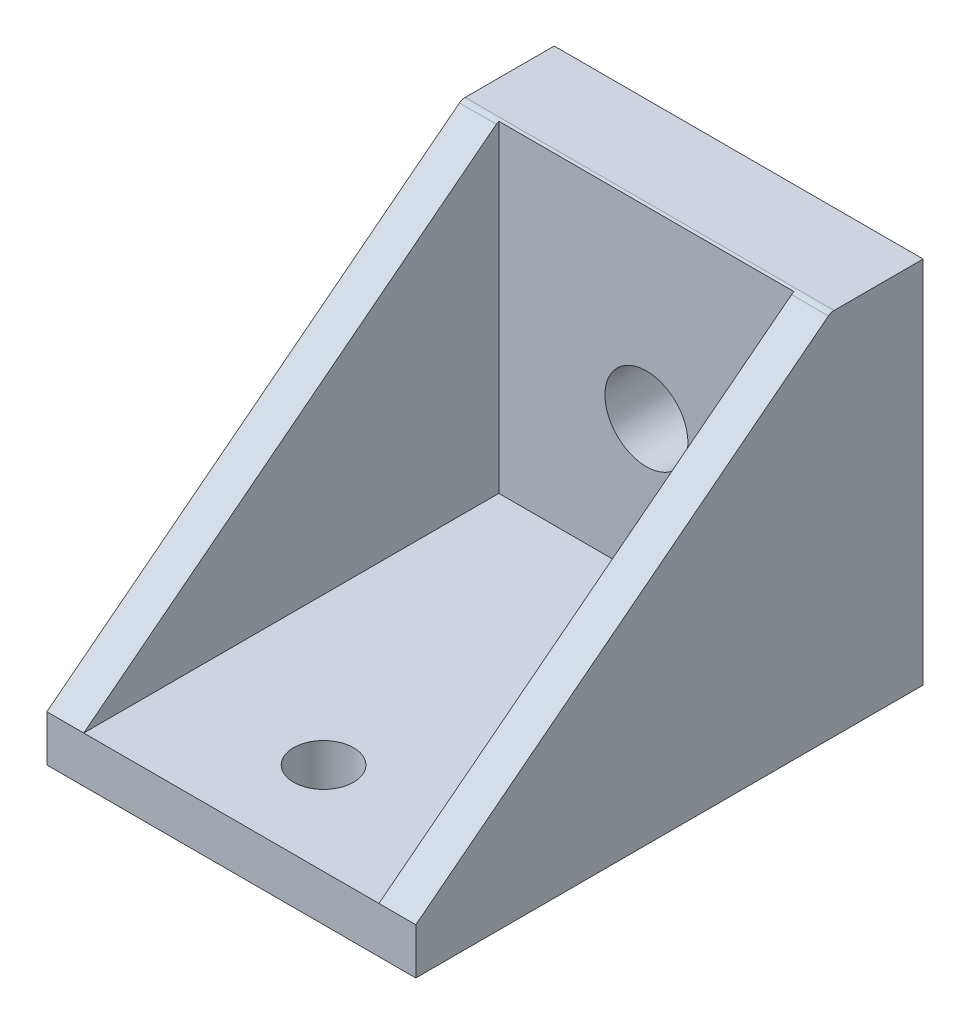
ISO-10303-21;
HEADER;
FILE_DESCRIPTION(('STEP AP214'),'2;1');
FILE_NAME('part.step','',(''),(''),'','','');
FILE_SCHEMA(('AUTOMOTIVE_DESIGN { 1 0 10303 214 1 1 1 1 }'));
ENDSEC;
DATA;
#1=APPLICATION_CONTEXT('core data for automotive mechanical design processes');
#2=APPLICATION_PROTOCOL_DEFINITION('international standard','automotive_design',2000,#1);
#3=PRODUCT_CONTEXT('',#1,'mechanical');
#4=PRODUCT('Part','Part','',(#3));
#5=PRODUCT_RELATED_PRODUCT_CATEGORY('part','',(#4));
#6=PRODUCT_DEFINITION_FORMATION('','',#4);
#7=PRODUCT_DEFINITION_CONTEXT('part definition',#1,'design');
#8=PRODUCT_DEFINITION('design','',#6,#7);
#9=PRODUCT_DEFINITION_SHAPE('','',#8);
#10=(LENGTH_UNIT() NAMED_UNIT(*) SI_UNIT(.MILLI.,.METRE.));
#11=(NAMED_UNIT(*) PLANE_ANGLE_UNIT() SI_UNIT($,.RADIAN.));
#12=(NAMED_UNIT(*) SI_UNIT($,.STERADIAN.) SOLID_ANGLE_UNIT());
#13=UNCERTAINTY_MEASURE_WITH_UNIT(LENGTH_MEASURE(1.E-05),#10,'distance_accuracy_value','');
#14=(GEOMETRIC_REPRESENTATION_CONTEXT(3) GLOBAL_UNCERTAINTY_ASSIGNED_CONTEXT((#13)) GLOBAL_UNIT_ASSIGNED_CONTEXT((#10,
#11,#12)) REPRESENTATION_CONTEXT('',''));
#15=CARTESIAN_POINT('',(0.,0.,0.));
#16=DIRECTION('',(0.,0.,1.));
#17=DIRECTION('',(1.,0.,0.));
#18=AXIS2_PLACEMENT_3D('',#15,#16,#17);
#19=CARTESIAN_POINT('',(0.,0.,10.));
#20=DIRECTION('',(0.,0.,-1.));
#21=DIRECTION('',(-1.,0.,0.));
#22=AXIS2_PLACEMENT_3D('',#19,#20,#21);
#23=PLANE('',#22);
#24=CARTESIAN_POINT('',(0.,0.,10.));
#25=DIRECTION('',(0.,0.,1.));
#26=DIRECTION('',(1.,0.,0.));
#27=AXIS2_PLACEMENT_3D('',#24,#25,#26);
#28=CIRCLE('',#27,4.5);
#29=CARTESIAN_POINT('',(4.50000000000001,0.,10.));
#30=VERTEX_POINT('',#29);
#31=EDGE_CURVE('E169',#30,#30,#28,.T.);
#32=ORIENTED_EDGE('',*,*,#31,.F.);
#33=EDGE_LOOP('',(#32));
#34=FACE_BOUND('',#33,.T.);
#35=DIRECTION('',(1.,0.,0.));
#36=VECTOR('',#35,1.);
#37=CARTESIAN_POINT('',(16.,19.9392960511962,10.));
#38=LINE('',#37,#36);
#39=CARTESIAN_POINT('',(16.,19.9392960511962,10.));
#40=VERTEX_POINT('',#39);
#41=CARTESIAN_POINT('',(-16.,19.9392960511962,10.));
#42=VERTEX_POINT('',#41);
#43=EDGE_CURVE('E201',#40,#42,#38,.F.);
#44=ORIENTED_EDGE('',*,*,#43,.T.);
#45=DIRECTION('',(0.,1.,0.));
#46=VECTOR('',#45,1.);
#47=CARTESIAN_POINT('',(-16.,20.,10.));
#48=LINE('',#47,#46);
#49=CARTESIAN_POINT('',(-16.,-15.,10.));
#50=VERTEX_POINT('',#49);
#51=EDGE_CURVE('E126',#50,#42,#48,.T.);
#52=ORIENTED_EDGE('',*,*,#51,.F.);
#53=DIRECTION('',(1.,0.,0.));
#54=VECTOR('',#53,1.);
#55=CARTESIAN_POINT('',(0.,-15.,10.));
#56=LINE('',#55,#54);
#57=CARTESIAN_POINT('',(16.,-15.,10.));
#58=VERTEX_POINT('',#57);
#59=EDGE_CURVE('E146',#50,#58,#56,.T.);
#60=ORIENTED_EDGE('',*,*,#59,.T.);
#61=DIRECTION('',(0.,1.,0.));
#62=VECTOR('',#61,1.);
#63=CARTESIAN_POINT('',(16.,20.,10.));
#64=LINE('',#63,#62);
#65=EDGE_CURVE('E210',#58,#40,#64,.T.);
#66=ORIENTED_EDGE('',*,*,#65,.T.);
#67=EDGE_LOOP('',(#44,#52,#60,#66));
#68=FACE_BOUND('',#67,.T.);
#69=ADVANCED_FACE('F39',(#34,#68),#23,.F.);
#70=CARTESIAN_POINT('',(0.,-15.,0.));
#71=DIRECTION('',(0.,1.,0.));
#72=DIRECTION('',(0.,0.,1.));
#73=AXIS2_PLACEMENT_3D('',#70,#71,#72);
#74=PLANE('',#73);
#75=CARTESIAN_POINT('',(0.,-15.,45.));
#76=DIRECTION('',(0.,-1.,0.));
#77=DIRECTION('',(0.,0.,-1.));
#78=AXIS2_PLACEMENT_3D('',#75,#76,#77);
#79=CIRCLE('',#78,3.25);
#80=CARTESIAN_POINT('',(0.,-15.,41.75));
#81=VERTEX_POINT('',#80);
#82=EDGE_CURVE('E157',#81,#81,#79,.T.);
#83=ORIENTED_EDGE('',*,*,#82,.T.);
#84=EDGE_LOOP('',(#83));
#85=FACE_BOUND('',#84,.T.);
#86=ORIENTED_EDGE('',*,*,#59,.F.);
#87=DIRECTION('',(0.,0.,-1.));
#88=VECTOR('',#87,1.);
#89=CARTESIAN_POINT('',(-16.,-15.,10.));
#90=LINE('',#89,#88);
#91=CARTESIAN_POINT('',(-16.,-15.,55.));
#92=VERTEX_POINT('',#91);
#93=EDGE_CURVE('E119',#92,#50,#90,.T.);
#94=ORIENTED_EDGE('',*,*,#93,.F.);
#95=DIRECTION('',(-1.,0.,0.));
#96=VECTOR('',#95,1.);
#97=CARTESIAN_POINT('',(-20.,-15.,55.));
#98=LINE('',#97,#96);
#99=CARTESIAN_POINT('',(16.,-15.,55.));
#100=VERTEX_POINT('',#99);
#101=EDGE_CURVE('E144',#100,#92,#98,.T.);
#102=ORIENTED_EDGE('',*,*,#101,.F.);
#103=DIRECTION('',(0.,0.,-1.));
#104=VECTOR('',#103,1.);
#105=CARTESIAN_POINT('',(16.,-15.,10.));
#106=LINE('',#105,#104);
#107=EDGE_CURVE('E215',#100,#58,#106,.T.);
#108=ORIENTED_EDGE('',*,*,#107,.T.);
#109=EDGE_LOOP('',(#86,#94,#102,#108));
#110=FACE_BOUND('',#109,.T.);
#111=ADVANCED_FACE('F142',(#85,#110),#74,.T.);
#112=CARTESIAN_POINT('',(0.,0.,0.));
#113=DIRECTION('',(0.,0.,-1.));
#114=DIRECTION('',(-1.,0.,0.));
#115=AXIS2_PLACEMENT_3D('',#112,#113,#114);
#116=PLANE('',#115);
#117=DIRECTION('',(-1.,0.,0.));
#118=VECTOR('',#117,1.);
#119=CARTESIAN_POINT('',(-20.,20.,0.));
#120=LINE('',#119,#118);
#121=CARTESIAN_POINT('',(20.,20.,0.));
#122=VERTEX_POINT('',#121);
#123=CARTESIAN_POINT('',(-20.,20.,0.));
#124=VERTEX_POINT('',#123);
#125=EDGE_CURVE('E177',#122,#124,#120,.T.);
#126=ORIENTED_EDGE('',*,*,#125,.F.);
#127=DIRECTION('',(0.,1.,0.));
#128=VECTOR('',#127,1.);
#129=CARTESIAN_POINT('',(20.,-20.,0.));
#130=LINE('',#129,#128);
#131=CARTESIAN_POINT('',(20.,-20.,0.));
#132=VERTEX_POINT('',#131);
#133=EDGE_CURVE('E172',#132,#122,#130,.T.);
#134=ORIENTED_EDGE('',*,*,#133,.F.);
#135=DIRECTION('',(1.,0.,0.));
#136=VECTOR('',#135,1.);
#137=CARTESIAN_POINT('',(-20.,-20.,0.));
#138=LINE('',#137,#136);
#139=CARTESIAN_POINT('',(-20.,-20.,0.));
#140=VERTEX_POINT('',#139);
#141=EDGE_CURVE('E182',#140,#132,#138,.T.);
#142=ORIENTED_EDGE('',*,*,#141,.F.);
#143=DIRECTION('',(0.,-1.,0.));
#144=VECTOR('',#143,1.);
#145=CARTESIAN_POINT('',(-20.,-20.,0.));
#146=LINE('',#145,#144);
#147=EDGE_CURVE('E180',#124,#140,#146,.T.);
#148=ORIENTED_EDGE('',*,*,#147,.F.);
#149=EDGE_LOOP('',(#126,#134,#142,#148));
#150=FACE_BOUND('',#149,.T.);
#151=CARTESIAN_POINT('',(0.,0.,0.));
#152=DIRECTION('',(0.,0.,1.));
#153=DIRECTION('',(1.,0.,0.));
#154=AXIS2_PLACEMENT_3D('',#151,#152,#153);
#155=CIRCLE('',#154,4.5);
#156=CARTESIAN_POINT('',(4.50000000000001,0.,0.));
#157=VERTEX_POINT('',#156);
#158=EDGE_CURVE('E168',#157,#157,#155,.T.);
#159=ORIENTED_EDGE('',*,*,#158,.T.);
#160=EDGE_LOOP('',(#159));
#161=FACE_BOUND('',#160,.T.);
#162=ADVANCED_FACE('F257',(#150,#161),#116,.T.);
#163=CARTESIAN_POINT('',(20.,-20.,10.));
#164=DIRECTION('',(-1.,0.,0.));
#165=DIRECTION('',(0.,0.,1.));
#166=AXIS2_PLACEMENT_3D('',#163,#164,#165);
#167=PLANE('',#166);
#168=DIRECTION('',(0.,0.,-1.));
#169=VECTOR('',#168,1.);
#170=CARTESIAN_POINT('',(20.,20.,10.));
#171=LINE('',#170,#169);
#172=CARTESIAN_POINT('',(20.,20.,9.65689224985838));
#173=VERTEX_POINT('',#172);
#174=EDGE_CURVE('E192',#173,#122,#171,.T.);
#175=ORIENTED_EDGE('',*,*,#174,.F.);
#176=CARTESIAN_POINT('',(20.,19.,9.65689224985838));
#177=DIRECTION('',(-1.,0.,0.));
#178=DIRECTION('',(0.,0.,1.));
#179=AXIS2_PLACEMENT_3D('',#176,#177,#178);
#180=CIRCLE('',#179,1.);
#181=CARTESIAN_POINT('',(20.,19.7893522173763,10.2708328633733));
#182=VERTEX_POINT('',#181);
#183=EDGE_CURVE('E11',#173,#182,#180,.F.);
#184=ORIENTED_EDGE('',*,*,#183,.T.);
#185=DIRECTION('',(0.,-0.61394061351492,0.789352217376326));
#186=VECTOR('',#185,1.);
#187=CARTESIAN_POINT('',(20.,-15.,55.));
#188=LINE('',#187,#186);
#189=CARTESIAN_POINT('',(20.,-15.,55.));
#190=VERTEX_POINT('',#189);
#191=EDGE_CURVE('E137',#182,#190,#188,.T.);
#192=ORIENTED_EDGE('',*,*,#191,.T.);
#193=DIRECTION('',(0.,-1.,0.));
#194=VECTOR('',#193,1.);
#195=CARTESIAN_POINT('',(20.,-15.,55.));
#196=LINE('',#195,#194);
#197=CARTESIAN_POINT('',(20.,-20.,55.));
#198=VERTEX_POINT('',#197);
#199=EDGE_CURVE('E155',#190,#198,#196,.T.);
#200=ORIENTED_EDGE('',*,*,#199,.T.);
#201=DIRECTION('',(0.,0.,-1.));
#202=VECTOR('',#201,1.);
#203=CARTESIAN_POINT('',(20.,-20.,10.));
#204=LINE('',#203,#202);
#205=EDGE_CURVE('E184',#198,#132,#204,.T.);
#206=ORIENTED_EDGE('',*,*,#205,.T.);
#207=ORIENTED_EDGE('',*,*,#133,.T.);
#208=EDGE_LOOP('',(#175,#184,#192,#200,#206,#207));
#209=FACE_BOUND('',#208,.T.);
#210=ADVANCED_FACE('F261',(#209),#167,.F.);
#211=CARTESIAN_POINT('',(-20.,20.,10.));
#212=DIRECTION('',(0.,-1.,0.));
#213=DIRECTION('',(0.,0.,-1.));
#214=AXIS2_PLACEMENT_3D('',#211,#212,#213);
#215=PLANE('',#214);
#216=DIRECTION('',(0.,0.,-1.));
#217=VECTOR('',#216,1.);
#218=CARTESIAN_POINT('',(-20.,20.,10.));
#219=LINE('',#218,#217);
#220=CARTESIAN_POINT('',(-20.,20.,9.65689224985838));
#221=VERTEX_POINT('',#220);
#222=EDGE_CURVE('E190',#221,#124,#219,.T.);
#223=ORIENTED_EDGE('',*,*,#222,.F.);
#224=DIRECTION('',(-1.,0.,0.));
#225=VECTOR('',#224,1.);
#226=CARTESIAN_POINT('',(20.,20.,9.65689224985838));
#227=LINE('',#226,#225);
#228=EDGE_CURVE('E199',#221,#173,#227,.F.);
#229=ORIENTED_EDGE('',*,*,#228,.T.);
#230=ORIENTED_EDGE('',*,*,#174,.T.);
#231=ORIENTED_EDGE('',*,*,#125,.T.);
#232=EDGE_LOOP('',(#223,#229,#230,#231));
#233=FACE_BOUND('',#232,.T.);
#234=ADVANCED_FACE('F246',(#233),#215,.F.);
#235=CARTESIAN_POINT('',(-20.,-20.,10.));
#236=DIRECTION('',(1.,0.,0.));
#237=DIRECTION('',(0.,0.,-1.));
#238=AXIS2_PLACEMENT_3D('',#235,#236,#237);
#239=PLANE('',#238);
#240=DIRECTION('',(0.,-0.61394061351492,0.789352217376326));
#241=VECTOR('',#240,1.);
#242=CARTESIAN_POINT('',(-20.,-15.,55.));
#243=LINE('',#242,#241);
#244=CARTESIAN_POINT('',(-20.,19.7893522173763,10.2708328633733));
#245=VERTEX_POINT('',#244);
#246=CARTESIAN_POINT('',(-20.,-15.,55.));
#247=VERTEX_POINT('',#246);
#248=EDGE_CURVE('E132',#245,#247,#243,.T.);
#249=ORIENTED_EDGE('',*,*,#248,.F.);
#250=CARTESIAN_POINT('',(-20.,19.,9.65689224985838));
#251=DIRECTION('',(1.,0.,0.));
#252=DIRECTION('',(0.,0.,-1.));
#253=AXIS2_PLACEMENT_3D('',#250,#251,#252);
#254=CIRCLE('',#253,1.);
#255=EDGE_CURVE('E196',#245,#221,#254,.F.);
#256=ORIENTED_EDGE('',*,*,#255,.T.);
#257=ORIENTED_EDGE('',*,*,#222,.T.);
#258=ORIENTED_EDGE('',*,*,#147,.T.);
#259=DIRECTION('',(0.,0.,-1.));
#260=VECTOR('',#259,1.);
#261=CARTESIAN_POINT('',(-20.,-20.,10.));
#262=LINE('',#261,#260);
#263=CARTESIAN_POINT('',(-20.,-20.,55.));
#264=VERTEX_POINT('',#263);
#265=EDGE_CURVE('E187',#264,#140,#262,.T.);
#266=ORIENTED_EDGE('',*,*,#265,.F.);
#267=DIRECTION('',(0.,-1.,0.));
#268=VECTOR('',#267,1.);
#269=CARTESIAN_POINT('',(-20.,-15.,55.));
#270=LINE('',#269,#268);
#271=EDGE_CURVE('E163',#247,#264,#270,.T.);
#272=ORIENTED_EDGE('',*,*,#271,.F.);
#273=EDGE_LOOP('',(#249,#256,#257,#258,#266,#272));
#274=FACE_BOUND('',#273,.T.);
#275=ADVANCED_FACE('F218',(#274),#239,.F.);
#276=CARTESIAN_POINT('',(-20.,-20.,10.));
#277=DIRECTION('',(0.,1.,0.));
#278=DIRECTION('',(0.,0.,1.));
#279=AXIS2_PLACEMENT_3D('',#276,#277,#278);
#280=PLANE('',#279);
#281=ORIENTED_EDGE('',*,*,#141,.T.);
#282=ORIENTED_EDGE('',*,*,#205,.F.);
#283=DIRECTION('',(-1.,0.,0.));
#284=VECTOR('',#283,1.);
#285=CARTESIAN_POINT('',(-20.,-20.,55.));
#286=LINE('',#285,#284);
#287=EDGE_CURVE('E153',#198,#264,#286,.T.);
#288=ORIENTED_EDGE('',*,*,#287,.T.);
#289=ORIENTED_EDGE('',*,*,#265,.T.);
#290=EDGE_LOOP('',(#281,#282,#288,#289));
#291=FACE_BOUND('',#290,.T.);
#292=CARTESIAN_POINT('',(0.,-20.,45.));
#293=DIRECTION('',(0.,-1.,0.));
#294=DIRECTION('',(0.,0.,-1.));
#295=AXIS2_PLACEMENT_3D('',#292,#293,#294);
#296=CIRCLE('',#295,3.25);
#297=CARTESIAN_POINT('',(0.,-20.,41.75));
#298=VERTEX_POINT('',#297);
#299=EDGE_CURVE('E160',#298,#298,#296,.T.);
#300=ORIENTED_EDGE('',*,*,#299,.F.);
#301=EDGE_LOOP('',(#300));
#302=FACE_BOUND('',#301,.T.);
#303=ADVANCED_FACE('F233',(#291,#302),#280,.F.);
#304=CARTESIAN_POINT('',(0.,0.,10.));
#305=DIRECTION('',(0.,0.,-1.));
#306=DIRECTION('',(-1.,0.,0.));
#307=AXIS2_PLACEMENT_3D('',#304,#305,#306);
#308=CYLINDRICAL_SURFACE('',#307,4.5);
#309=ORIENTED_EDGE('',*,*,#31,.T.);
#310=EDGE_LOOP('',(#309));
#311=FACE_BOUND('',#310,.T.);
#312=ORIENTED_EDGE('',*,*,#158,.F.);
#313=EDGE_LOOP('',(#312));
#314=FACE_BOUND('',#313,.T.);
#315=ADVANCED_FACE('F235',(#311,#314),#308,.F.);
#316=CARTESIAN_POINT('',(-20.,-15.,55.));
#317=DIRECTION('',(0.,0.,1.));
#318=DIRECTION('',(1.,0.,0.));
#319=AXIS2_PLACEMENT_3D('',#316,#317,#318);
#320=PLANE('',#319);
#321=ORIENTED_EDGE('',*,*,#287,.F.);
#322=ORIENTED_EDGE('',*,*,#199,.F.);
#323=EDGE_CURVE('E152',#190,#100,#98,.T.);
#324=ORIENTED_EDGE('',*,*,#323,.T.);
#325=ORIENTED_EDGE('',*,*,#101,.T.);
#326=DIRECTION('',(-1.,0.,0.));
#327=VECTOR('',#326,1.);
#328=CARTESIAN_POINT('',(-16.,-15.,55.));
#329=LINE('',#328,#327);
#330=EDGE_CURVE('E129',#92,#247,#329,.T.);
#331=ORIENTED_EDGE('',*,*,#330,.T.);
#332=ORIENTED_EDGE('',*,*,#271,.T.);
#333=EDGE_LOOP('',(#321,#322,#324,#325,#331,#332));
#334=FACE_BOUND('',#333,.T.);
#335=ADVANCED_FACE('F149',(#334),#320,.T.);
#336=CARTESIAN_POINT('',(0.,-15.,45.));
#337=DIRECTION('',(0.,-1.,0.));
#338=DIRECTION('',(0.,0.,-1.));
#339=AXIS2_PLACEMENT_3D('',#336,#337,#338);
#340=CYLINDRICAL_SURFACE('',#339,3.25);
#341=ORIENTED_EDGE('',*,*,#82,.F.);
#342=EDGE_LOOP('',(#341));
#343=FACE_BOUND('',#342,.T.);
#344=ORIENTED_EDGE('',*,*,#299,.T.);
#345=EDGE_LOOP('',(#344));
#346=FACE_BOUND('',#345,.T.);
#347=ADVANCED_FACE('F231',(#343,#346),#340,.F.);
#348=CARTESIAN_POINT('',(16.,-15.,55.));
#349=DIRECTION('',(0.,0.789352217376326,0.61394061351492));
#350=DIRECTION('',(0.,-0.613940613514921,0.789352217376326));
#351=AXIS2_PLACEMENT_3D('',#348,#349,#350);
#352=PLANE('',#351);
#353=ORIENTED_EDGE('',*,*,#191,.F.);
#354=DIRECTION('',(-1.,0.,0.));
#355=VECTOR('',#354,1.);
#356=CARTESIAN_POINT('',(16.,19.7893522173763,10.2708328633733));
#357=LINE('',#356,#355);
#358=CARTESIAN_POINT('',(16.,19.7893522173763,10.2708328633733));
#359=VERTEX_POINT('',#358);
#360=EDGE_CURVE('E54',#182,#359,#357,.T.);
#361=ORIENTED_EDGE('',*,*,#360,.T.);
#362=DIRECTION('',(0.,-0.61394061351492,0.789352217376326));
#363=VECTOR('',#362,1.);
#364=CARTESIAN_POINT('',(16.,-15.,55.));
#365=LINE('',#364,#363);
#366=EDGE_CURVE('E211',#359,#100,#365,.T.);
#367=ORIENTED_EDGE('',*,*,#366,.T.);
#368=ORIENTED_EDGE('',*,*,#323,.F.);
#369=EDGE_LOOP('',(#353,#361,#367,#368));
#370=FACE_BOUND('',#369,.T.);
#371=ADVANCED_FACE('F273',(#370),#352,.T.);
#372=CARTESIAN_POINT('',(16.,0.,0.));
#373=DIRECTION('',(1.,0.,0.));
#374=DIRECTION('',(0.,0.,-1.));
#375=AXIS2_PLACEMENT_3D('',#372,#373,#374);
#376=PLANE('',#375);
#377=ORIENTED_EDGE('',*,*,#366,.F.);
#378=CARTESIAN_POINT('',(16.,19.,9.65689224985838));
#379=DIRECTION('',(1.,0.,0.));
#380=DIRECTION('',(0.,0.,-1.));
#381=AXIS2_PLACEMENT_3D('',#378,#379,#380);
#382=CIRCLE('',#381,1.);
#383=EDGE_CURVE('E47',#359,#40,#382,.F.);
#384=ORIENTED_EDGE('',*,*,#383,.T.);
#385=ORIENTED_EDGE('',*,*,#65,.F.);
#386=ORIENTED_EDGE('',*,*,#107,.F.);
#387=EDGE_LOOP('',(#377,#384,#385,#386));
#388=FACE_BOUND('',#387,.T.);
#389=ADVANCED_FACE('F208',(#388),#376,.F.);
#390=CARTESIAN_POINT('',(-16.,-15.,55.));
#391=DIRECTION('',(0.,-0.789352217376326,-0.61394061351492));
#392=DIRECTION('',(0.,0.613940613514921,-0.789352217376326));
#393=AXIS2_PLACEMENT_3D('',#390,#391,#392);
#394=PLANE('',#393);
#395=DIRECTION('',(0.,-0.61394061351492,0.789352217376326));
#396=VECTOR('',#395,1.);
#397=CARTESIAN_POINT('',(-16.,-15.,55.));
#398=LINE('',#397,#396);
#399=CARTESIAN_POINT('',(-16.,19.7893522173763,10.2708328633733));
#400=VERTEX_POINT('',#399);
#401=EDGE_CURVE('E114',#400,#92,#398,.T.);
#402=ORIENTED_EDGE('',*,*,#401,.F.);
#403=DIRECTION('',(-1.,0.,0.));
#404=VECTOR('',#403,1.);
#405=CARTESIAN_POINT('',(-16.,19.7893522173763,10.2708328633733));
#406=LINE('',#405,#404);
#407=EDGE_CURVE('E194',#400,#245,#406,.T.);
#408=ORIENTED_EDGE('',*,*,#407,.T.);
#409=ORIENTED_EDGE('',*,*,#248,.T.);
#410=ORIENTED_EDGE('',*,*,#330,.F.);
#411=EDGE_LOOP('',(#402,#408,#409,#410));
#412=FACE_BOUND('',#411,.T.);
#413=ADVANCED_FACE('F130',(#412),#394,.F.);
#414=CARTESIAN_POINT('',(-16.,0.,0.));
#415=DIRECTION('',(-1.,0.,0.));
#416=DIRECTION('',(0.,0.,-1.));
#417=AXIS2_PLACEMENT_3D('',#414,#415,#416);
#418=PLANE('',#417);
#419=ORIENTED_EDGE('',*,*,#51,.T.);
#420=CARTESIAN_POINT('',(-16.,19.,9.65689224985838));
#421=DIRECTION('',(-1.,0.,0.));
#422=DIRECTION('',(0.,0.,1.));
#423=AXIS2_PLACEMENT_3D('',#420,#421,#422);
#424=CIRCLE('',#423,1.);
#425=EDGE_CURVE('E122',#42,#400,#424,.F.);
#426=ORIENTED_EDGE('',*,*,#425,.T.);
#427=ORIENTED_EDGE('',*,*,#401,.T.);
#428=ORIENTED_EDGE('',*,*,#93,.T.);
#429=EDGE_LOOP('',(#419,#426,#427,#428));
#430=FACE_BOUND('',#429,.T.);
#431=ADVANCED_FACE('F117',(#430),#418,.F.);
#432=CARTESIAN_POINT('',(16.,19.,9.65689224985838));
#433=DIRECTION('',(1.,0.,0.));
#434=DIRECTION('',(0.,0.,-1.));
#435=AXIS2_PLACEMENT_3D('',#432,#433,#434);
#436=CYLINDRICAL_SURFACE('',#435,1.);
#437=ORIENTED_EDGE('',*,*,#183,.F.);
#438=ORIENTED_EDGE('',*,*,#228,.F.);
#439=ORIENTED_EDGE('',*,*,#255,.F.);
#440=ORIENTED_EDGE('',*,*,#407,.F.);
#441=ORIENTED_EDGE('',*,*,#425,.F.);
#442=ORIENTED_EDGE('',*,*,#43,.F.);
#443=ORIENTED_EDGE('',*,*,#383,.F.);
#444=ORIENTED_EDGE('',*,*,#360,.F.);
#445=EDGE_LOOP('',(#437,#438,#439,#440,#441,#442,#443,#444));
#446=FACE_BOUND('',#445,.T.);
#447=ADVANCED_FACE('F41',(#446),#436,.T.);
#448=CLOSED_SHELL('',(#69,#111,#162,#210,#234,#275,#303,#315,#335,#347,#371,#389,#413,#431,#447));
#449=MANIFOLD_SOLID_BREP('B2',#448);
#450=ADVANCED_BREP_SHAPE_REPRESENTATION('',(#18,#449),#14);
#451=SHAPE_DEFINITION_REPRESENTATION(#9,#450);
ENDSEC;
END-ISO-10303-21;
